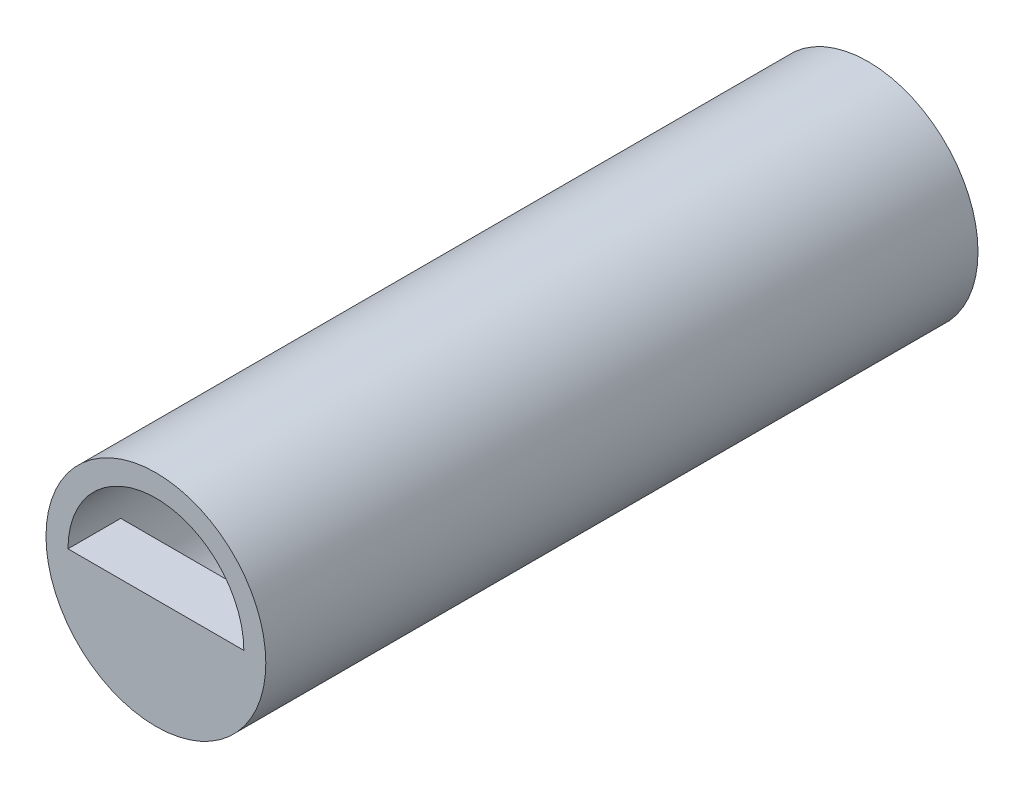
ISO-10303-21;
HEADER;
FILE_DESCRIPTION(('STEP AP214'),'2;1');
FILE_NAME('part.step','',(''),(''),'','','');
FILE_SCHEMA(('AUTOMOTIVE_DESIGN { 1 0 10303 214 1 1 1 1 }'));
ENDSEC;
DATA;
#1=APPLICATION_CONTEXT('core data for automotive mechanical design processes');
#2=APPLICATION_PROTOCOL_DEFINITION('international standard','automotive_design',2000,#1);
#3=PRODUCT_CONTEXT('',#1,'mechanical');
#4=PRODUCT('Part','Part','',(#3));
#5=PRODUCT_RELATED_PRODUCT_CATEGORY('part','',(#4));
#6=PRODUCT_DEFINITION_FORMATION('','',#4);
#7=PRODUCT_DEFINITION_CONTEXT('part definition',#1,'design');
#8=PRODUCT_DEFINITION('design','',#6,#7);
#9=PRODUCT_DEFINITION_SHAPE('','',#8);
#10=(LENGTH_UNIT() NAMED_UNIT(*) SI_UNIT(.MILLI.,.METRE.));
#11=(NAMED_UNIT(*) PLANE_ANGLE_UNIT() SI_UNIT($,.RADIAN.));
#12=(NAMED_UNIT(*) SI_UNIT($,.STERADIAN.) SOLID_ANGLE_UNIT());
#13=UNCERTAINTY_MEASURE_WITH_UNIT(LENGTH_MEASURE(1.E-05),#10,'distance_accuracy_value','');
#14=(GEOMETRIC_REPRESENTATION_CONTEXT(3) GLOBAL_UNCERTAINTY_ASSIGNED_CONTEXT((#13)) GLOBAL_UNIT_ASSIGNED_CONTEXT((#10,
#11,#12)) REPRESENTATION_CONTEXT('',''));
#15=CARTESIAN_POINT('',(0.,0.,0.));
#16=DIRECTION('',(0.,0.,1.));
#17=DIRECTION('',(1.,0.,0.));
#18=AXIS2_PLACEMENT_3D('',#15,#16,#17);
#19=CARTESIAN_POINT('',(0.,0.,0.));
#20=DIRECTION('',(0.,0.,1.));
#21=DIRECTION('',(1.,0.,0.));
#22=AXIS2_PLACEMENT_3D('',#19,#20,#21);
#23=PLANE('',#22);
#24=CARTESIAN_POINT('',(0.,0.,0.));
#25=DIRECTION('',(0.,0.,1.));
#26=DIRECTION('',(1.,0.,0.));
#27=AXIS2_PLACEMENT_3D('',#24,#25,#26);
#28=CIRCLE('',#27,2.5);
#29=CARTESIAN_POINT('',(2.5,0.,0.));
#30=VERTEX_POINT('',#29);
#31=EDGE_CURVE('E11',#30,#30,#28,.T.);
#32=ORIENTED_EDGE('',*,*,#31,.F.);
#33=EDGE_LOOP('',(#32));
#34=FACE_BOUND('',#33,.T.);
#35=CARTESIAN_POINT('',(0.,0.,0.));
#36=DIRECTION('',(0.,0.,1.));
#37=DIRECTION('',(1.,0.,0.));
#38=AXIS2_PLACEMENT_3D('',#35,#36,#37);
#39=CIRCLE('',#38,2.);
#40=CARTESIAN_POINT('',(2.,0.,0.));
#41=VERTEX_POINT('',#40);
#42=EDGE_CURVE('E41',#41,#41,#39,.T.);
#43=ORIENTED_EDGE('',*,*,#42,.T.);
#44=EDGE_LOOP('',(#43));
#45=FACE_BOUND('',#44,.T.);
#46=ADVANCED_FACE('F33',(#34,#45),#23,.F.);
#47=CARTESIAN_POINT('',(0.,0.,15.));
#48=DIRECTION('',(0.,0.,-1.));
#49=DIRECTION('',(-1.,0.,0.));
#50=AXIS2_PLACEMENT_3D('',#47,#48,#49);
#51=CYLINDRICAL_SURFACE('',#50,2.5);
#52=ORIENTED_EDGE('',*,*,#31,.T.);
#53=EDGE_LOOP('',(#52));
#54=FACE_BOUND('',#53,.T.);
#55=CARTESIAN_POINT('',(0.,0.,16.2));
#56=DIRECTION('',(0.,0.,1.));
#57=DIRECTION('',(1.,0.,0.));
#58=AXIS2_PLACEMENT_3D('',#55,#56,#57);
#59=CIRCLE('',#58,2.5);
#60=CARTESIAN_POINT('',(2.5,0.,16.2));
#61=VERTEX_POINT('',#60);
#62=EDGE_CURVE('E65',#61,#61,#59,.T.);
#63=ORIENTED_EDGE('',*,*,#62,.F.);
#64=EDGE_LOOP('',(#63));
#65=FACE_BOUND('',#64,.T.);
#66=ADVANCED_FACE('F35',(#54,#65),#51,.T.);
#67=CARTESIAN_POINT('',(0.,0.,15.));
#68=DIRECTION('',(0.,0.,-1.));
#69=DIRECTION('',(-1.,0.,0.));
#70=AXIS2_PLACEMENT_3D('',#67,#68,#69);
#71=CYLINDRICAL_SURFACE('',#70,2.);
#72=CARTESIAN_POINT('',(0.,0.,15.));
#73=DIRECTION('',(0.,0.,1.));
#74=DIRECTION('',(1.,0.,0.));
#75=AXIS2_PLACEMENT_3D('',#72,#73,#74);
#76=CIRCLE('',#75,2.);
#77=CARTESIAN_POINT('',(-2.,0.,15.));
#78=VERTEX_POINT('',#77);
#79=CARTESIAN_POINT('',(2.,0.,15.));
#80=VERTEX_POINT('',#79);
#81=EDGE_CURVE('E64',#78,#80,#76,.T.);
#82=ORIENTED_EDGE('',*,*,#81,.T.);
#83=DIRECTION('',(0.,0.,1.));
#84=VECTOR('',#83,1.);
#85=CARTESIAN_POINT('',(2.,0.,15.));
#86=LINE('',#85,#84);
#87=CARTESIAN_POINT('',(2.,0.,16.2));
#88=VERTEX_POINT('',#87);
#89=EDGE_CURVE('E48',#80,#88,#86,.T.);
#90=ORIENTED_EDGE('',*,*,#89,.T.);
#91=CARTESIAN_POINT('',(0.,0.,16.2));
#92=DIRECTION('',(0.,0.,1.));
#93=DIRECTION('',(1.,0.,0.));
#94=AXIS2_PLACEMENT_3D('',#91,#92,#93);
#95=CIRCLE('',#94,2.);
#96=CARTESIAN_POINT('',(-2.,0.,16.2));
#97=VERTEX_POINT('',#96);
#98=EDGE_CURVE('E55',#88,#97,#95,.T.);
#99=ORIENTED_EDGE('',*,*,#98,.T.);
#100=DIRECTION('',(0.,0.,1.));
#101=VECTOR('',#100,1.);
#102=CARTESIAN_POINT('',(-2.,0.,15.));
#103=LINE('',#102,#101);
#104=EDGE_CURVE('E66',#78,#97,#103,.T.);
#105=ORIENTED_EDGE('',*,*,#104,.F.);
#106=EDGE_LOOP('',(#82,#90,#99,#105));
#107=FACE_BOUND('',#106,.T.);
#108=ORIENTED_EDGE('',*,*,#42,.F.);
#109=EDGE_LOOP('',(#108));
#110=FACE_BOUND('',#109,.T.);
#111=ADVANCED_FACE('F61',(#107,#110),#71,.F.);
#112=CARTESIAN_POINT('',(0.,0.,15.));
#113=DIRECTION('',(0.,0.,1.));
#114=DIRECTION('',(1.,0.,0.));
#115=AXIS2_PLACEMENT_3D('',#112,#113,#114);
#116=PLANE('',#115);
#117=ORIENTED_EDGE('',*,*,#81,.F.);
#118=DIRECTION('',(1.,0.,0.));
#119=VECTOR('',#118,1.);
#120=CARTESIAN_POINT('',(2.,0.,15.));
#121=LINE('',#120,#119);
#122=EDGE_CURVE('E72',#78,#80,#121,.T.);
#123=ORIENTED_EDGE('',*,*,#122,.T.);
#124=EDGE_LOOP('',(#117,#123));
#125=FACE_BOUND('',#124,.T.);
#126=ADVANCED_FACE('F86',(#125),#116,.F.);
#127=CARTESIAN_POINT('',(0.,0.,16.2));
#128=DIRECTION('',(0.,0.,1.));
#129=DIRECTION('',(1.,0.,0.));
#130=AXIS2_PLACEMENT_3D('',#127,#128,#129);
#131=PLANE('',#130);
#132=ORIENTED_EDGE('',*,*,#98,.F.);
#133=DIRECTION('',(1.,0.,0.));
#134=VECTOR('',#133,1.);
#135=CARTESIAN_POINT('',(2.,0.,16.2));
#136=LINE('',#135,#134);
#137=EDGE_CURVE('E69',#97,#88,#136,.T.);
#138=ORIENTED_EDGE('',*,*,#137,.F.);
#139=EDGE_LOOP('',(#132,#138));
#140=FACE_BOUND('',#139,.T.);
#141=ORIENTED_EDGE('',*,*,#62,.T.);
#142=EDGE_LOOP('',(#141));
#143=FACE_BOUND('',#142,.T.);
#144=ADVANCED_FACE('F74',(#140,#143),#131,.T.);
#145=CARTESIAN_POINT('',(2.,0.,15.));
#146=DIRECTION('',(0.,-1.,0.));
#147=DIRECTION('',(0.,0.,-1.));
#148=AXIS2_PLACEMENT_3D('',#145,#146,#147);
#149=PLANE('',#148);
#150=ORIENTED_EDGE('',*,*,#137,.T.);
#151=ORIENTED_EDGE('',*,*,#89,.F.);
#152=ORIENTED_EDGE('',*,*,#122,.F.);
#153=ORIENTED_EDGE('',*,*,#104,.T.);
#154=EDGE_LOOP('',(#150,#151,#152,#153));
#155=FACE_BOUND('',#154,.T.);
#156=ADVANCED_FACE('F70',(#155),#149,.F.);
#157=CLOSED_SHELL('',(#46,#66,#111,#126,#144,#156));
#158=MANIFOLD_SOLID_BREP('B2',#157);
#159=ADVANCED_BREP_SHAPE_REPRESENTATION('',(#18,#158),#14);
#160=SHAPE_DEFINITION_REPRESENTATION(#9,#159);
ENDSEC;
END-ISO-10303-21;
